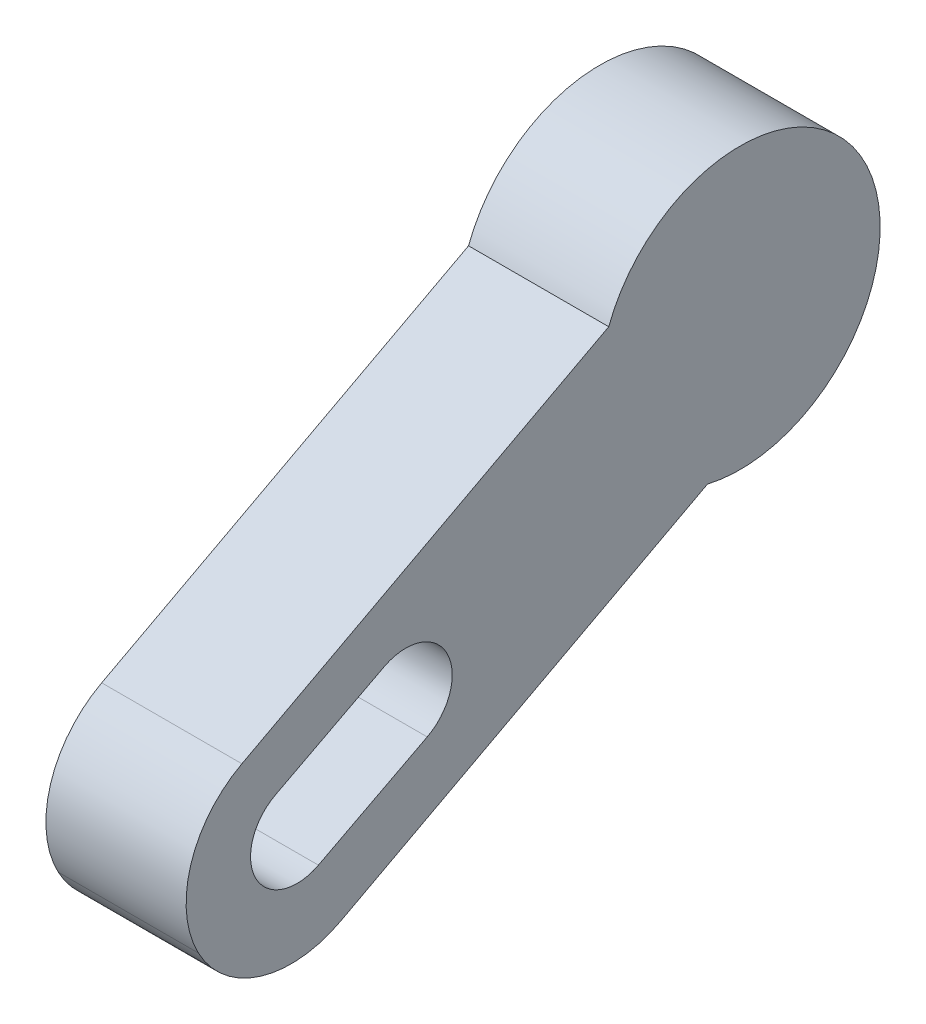
ISO-10303-21;
HEADER;
FILE_DESCRIPTION(('STEP AP214'),'2;1');
FILE_NAME('part.step','',(''),(''),'','','');
FILE_SCHEMA(('AUTOMOTIVE_DESIGN { 1 0 10303 214 1 1 1 1 }'));
ENDSEC;
DATA;
#1=APPLICATION_CONTEXT('core data for automotive mechanical design processes');
#2=APPLICATION_PROTOCOL_DEFINITION('international standard','automotive_design',2000,#1);
#3=PRODUCT_CONTEXT('',#1,'mechanical');
#4=PRODUCT('Part','Part','',(#3));
#5=PRODUCT_RELATED_PRODUCT_CATEGORY('part','',(#4));
#6=PRODUCT_DEFINITION_FORMATION('','',#4);
#7=PRODUCT_DEFINITION_CONTEXT('part definition',#1,'design');
#8=PRODUCT_DEFINITION('design','',#6,#7);
#9=PRODUCT_DEFINITION_SHAPE('','',#8);
#10=(LENGTH_UNIT() NAMED_UNIT(*) SI_UNIT(.MILLI.,.METRE.));
#11=(NAMED_UNIT(*) PLANE_ANGLE_UNIT() SI_UNIT($,.RADIAN.));
#12=(NAMED_UNIT(*) SI_UNIT($,.STERADIAN.) SOLID_ANGLE_UNIT());
#13=UNCERTAINTY_MEASURE_WITH_UNIT(LENGTH_MEASURE(1.E-05),#10,'distance_accuracy_value','');
#14=(GEOMETRIC_REPRESENTATION_CONTEXT(3) GLOBAL_UNCERTAINTY_ASSIGNED_CONTEXT((#13)) GLOBAL_UNIT_ASSIGNED_CONTEXT((#10,
#11,#12)) REPRESENTATION_CONTEXT('',''));
#15=CARTESIAN_POINT('',(0.,0.,0.));
#16=DIRECTION('',(0.,0.,1.));
#17=DIRECTION('',(1.,0.,0.));
#18=AXIS2_PLACEMENT_3D('',#15,#16,#17);
#19=CARTESIAN_POINT('',(2.5,0.,0.));
#20=DIRECTION('',(-1.,0.,0.));
#21=DIRECTION('',(0.,0.,1.));
#22=AXIS2_PLACEMENT_3D('',#19,#20,#21);
#23=PLANE('',#22);
#24=CARTESIAN_POINT('',(2.5,0.,0.));
#25=DIRECTION('',(-1.,0.,0.));
#26=DIRECTION('',(0.,0.,1.));
#27=AXIS2_PLACEMENT_3D('',#24,#25,#26);
#28=CIRCLE('',#27,2.6);
#29=CARTESIAN_POINT('',(2.5,0.,2.6));
#30=VERTEX_POINT('',#29);
#31=EDGE_CURVE('E272',#30,#30,#28,.T.);
#32=ORIENTED_EDGE('',*,*,#31,.T.);
#33=EDGE_LOOP('',(#32));
#34=FACE_BOUND('',#33,.T.);
#35=DIRECTION('',(0.,0.,-1.));
#36=VECTOR('',#35,1.);
#37=CARTESIAN_POINT('',(2.5,0.750000000000012,1.6));
#38=LINE('',#37,#36);
#39=CARTESIAN_POINT('',(2.5,0.75000000000001,1.3));
#40=VERTEX_POINT('',#39);
#41=CARTESIAN_POINT('',(2.5,0.750000000000006,0.649999999999994));
#42=VERTEX_POINT('',#41);
#43=EDGE_CURVE('E244',#40,#42,#38,.T.);
#44=ORIENTED_EDGE('',*,*,#43,.F.);
#45=CARTESIAN_POINT('',(2.5,0.45000000000001,1.3));
#46=DIRECTION('',(-1.,0.,0.));
#47=DIRECTION('',(0.,0.,1.));
#48=AXIS2_PLACEMENT_3D('',#45,#46,#47);
#49=CIRCLE('',#48,0.3);
#50=CARTESIAN_POINT('',(2.5,0.450000000000012,1.6));
#51=VERTEX_POINT('',#50);
#52=EDGE_CURVE('E326',#40,#51,#49,.F.);
#53=ORIENTED_EDGE('',*,*,#52,.T.);
#54=DIRECTION('',(0.,1.,0.));
#55=VECTOR('',#54,1.);
#56=CARTESIAN_POINT('',(2.5,-0.749999999999988,1.60000000000001));
#57=LINE('',#56,#55);
#58=CARTESIAN_POINT('',(2.5,-0.449999999999989,1.6));
#59=VERTEX_POINT('',#58);
#60=EDGE_CURVE('E196',#59,#51,#57,.T.);
#61=ORIENTED_EDGE('',*,*,#60,.F.);
#62=CARTESIAN_POINT('',(2.5,-0.449999999999991,1.3));
#63=DIRECTION('',(-1.,0.,0.));
#64=DIRECTION('',(0.,0.,1.));
#65=AXIS2_PLACEMENT_3D('',#62,#63,#64);
#66=CIRCLE('',#65,0.3);
#67=CARTESIAN_POINT('',(2.5,-0.749999999999991,1.30000000000001));
#68=VERTEX_POINT('',#67);
#69=EDGE_CURVE('E324',#59,#68,#66,.F.);
#70=ORIENTED_EDGE('',*,*,#69,.T.);
#71=DIRECTION('',(0.,0.,1.));
#72=VECTOR('',#71,1.);
#73=CARTESIAN_POINT('',(2.5,-0.749999999999988,1.60000000000001));
#74=LINE('',#73,#72);
#75=CARTESIAN_POINT('',(2.5,-0.750000000000009,-1.3));
#76=VERTEX_POINT('',#75);
#77=EDGE_CURVE('E224',#76,#68,#74,.T.);
#78=ORIENTED_EDGE('',*,*,#77,.F.);
#79=CARTESIAN_POINT('',(2.5,-0.450000000000009,-1.3));
#80=DIRECTION('',(-1.,0.,0.));
#81=DIRECTION('',(0.,0.,1.));
#82=AXIS2_PLACEMENT_3D('',#79,#80,#81);
#83=CIRCLE('',#82,0.3);
#84=CARTESIAN_POINT('',(2.5,-0.450000000000012,-1.6));
#85=VERTEX_POINT('',#84);
#86=EDGE_CURVE('E328',#76,#85,#83,.F.);
#87=ORIENTED_EDGE('',*,*,#86,.T.);
#88=DIRECTION('',(0.,-1.,0.));
#89=VECTOR('',#88,1.);
#90=CARTESIAN_POINT('',(2.5,-0.750000000000012,-1.6));
#91=LINE('',#90,#89);
#92=CARTESIAN_POINT('',(2.5,0.449999999999974,-1.6));
#93=VERTEX_POINT('',#92);
#94=EDGE_CURVE('E255',#93,#85,#91,.T.);
#95=ORIENTED_EDGE('',*,*,#94,.F.);
#96=CARTESIAN_POINT('',(2.5,0.449999999999976,-1.3));
#97=DIRECTION('',(-1.,0.,0.));
#98=DIRECTION('',(0.,0.,1.));
#99=AXIS2_PLACEMENT_3D('',#96,#97,#98);
#100=CIRCLE('',#99,0.3);
#101=CARTESIAN_POINT('',(2.5,0.749999999999976,-1.29999999999999));
#102=VERTEX_POINT('',#101);
#103=EDGE_CURVE('E330',#93,#102,#100,.F.);
#104=ORIENTED_EDGE('',*,*,#103,.T.);
#105=DIRECTION('',(0.,0.,-1.));
#106=VECTOR('',#105,1.);
#107=CARTESIAN_POINT('',(2.5,0.74999999999995,-0.650000000000005));
#108=LINE('',#107,#106);
#109=CARTESIAN_POINT('',(2.5,0.74999999999995,-0.650000000000005));
#110=VERTEX_POINT('',#109);
#111=EDGE_CURVE('E252',#110,#102,#108,.T.);
#112=ORIENTED_EDGE('',*,*,#111,.F.);
#113=DIRECTION('',(0.,-1.,0.));
#114=VECTOR('',#113,1.);
#115=CARTESIAN_POINT('',(2.5,0.74999999999995,-0.650000000000005));
#116=LINE('',#115,#114);
#117=CARTESIAN_POINT('',(2.5,1.24999999999995,-0.650000000000009));
#118=VERTEX_POINT('',#117);
#119=EDGE_CURVE('E250',#118,#110,#116,.T.);
#120=ORIENTED_EDGE('',*,*,#119,.F.);
#121=DIRECTION('',(0.,0.,-1.));
#122=VECTOR('',#121,1.);
#123=CARTESIAN_POINT('',(2.5,1.24999999999996,0.649999999999991));
#124=LINE('',#123,#122);
#125=CARTESIAN_POINT('',(2.5,1.24999999999996,0.649999999999991));
#126=VERTEX_POINT('',#125);
#127=EDGE_CURVE('E248',#126,#118,#124,.T.);
#128=ORIENTED_EDGE('',*,*,#127,.F.);
#129=DIRECTION('',(0.,1.,0.));
#130=VECTOR('',#129,1.);
#131=CARTESIAN_POINT('',(2.5,0.750000000000006,0.649999999999994));
#132=LINE('',#131,#130);
#133=EDGE_CURVE('E246',#42,#126,#132,.T.);
#134=ORIENTED_EDGE('',*,*,#133,.F.);
#135=EDGE_LOOP('',(#44,#53,#61,#70,#78,#87,#95,#104,#112,#120,#128,#134));
#136=FACE_BOUND('',#135,.T.);
#137=ADVANCED_FACE('F32',(#34,#136),#23,.T.);
#138=CARTESIAN_POINT('',(4.,0.,0.));
#139=DIRECTION('',(-1.,0.,0.));
#140=DIRECTION('',(0.,0.,1.));
#141=AXIS2_PLACEMENT_3D('',#138,#139,#140);
#142=CYLINDRICAL_SURFACE('',#141,4.);
#143=DIRECTION('',(-1.,0.,0.));
#144=VECTOR('',#143,1.);
#145=CARTESIAN_POINT('',(4.,1.40673777582846,3.7444744397655));
#146=LINE('',#145,#144);
#147=CARTESIAN_POINT('',(4.,1.40673777582846,3.7444744397655));
#148=VERTEX_POINT('',#147);
#149=CARTESIAN_POINT('',(0.,1.40673777582846,3.7444744397655));
#150=VERTEX_POINT('',#149);
#151=EDGE_CURVE('E288',#148,#150,#146,.T.);
#152=ORIENTED_EDGE('',*,*,#151,.F.);
#153=CARTESIAN_POINT('',(4.,0.,0.));
#154=DIRECTION('',(1.,0.,0.));
#155=DIRECTION('',(0.,0.,-1.));
#156=AXIS2_PLACEMENT_3D('',#153,#154,#155);
#157=CIRCLE('',#156,4.);
#158=CARTESIAN_POINT('',(4.,-3.8909477813251,0.927645063050152));
#159=VERTEX_POINT('',#158);
#160=EDGE_CURVE('E292',#159,#148,#157,.T.);
#161=ORIENTED_EDGE('',*,*,#160,.F.);
#162=DIRECTION('',(-1.,0.,0.));
#163=VECTOR('',#162,1.);
#164=CARTESIAN_POINT('',(4.,-3.8909477813251,0.927645063050152));
#165=LINE('',#164,#163);
#166=CARTESIAN_POINT('',(0.,-3.89094778132509,0.927645063050152));
#167=VERTEX_POINT('',#166);
#168=EDGE_CURVE('E283',#167,#159,#165,.F.);
#169=ORIENTED_EDGE('',*,*,#168,.F.);
#170=CARTESIAN_POINT('',(0.,0.,0.));
#171=DIRECTION('',(1.,0.,0.));
#172=DIRECTION('',(0.,0.,-1.));
#173=AXIS2_PLACEMENT_3D('',#170,#171,#172);
#174=CIRCLE('',#173,4.);
#175=EDGE_CURVE('E291',#167,#150,#174,.T.);
#176=ORIENTED_EDGE('',*,*,#175,.T.);
#177=EDGE_LOOP('',(#152,#161,#169,#176));
#178=FACE_BOUND('',#177,.T.);
#179=ADVANCED_FACE('F365',(#178),#142,.T.);
#180=CARTESIAN_POINT('',(4.,0.,0.));
#181=DIRECTION('',(1.,0.,0.));
#182=DIRECTION('',(0.,0.,-1.));
#183=AXIS2_PLACEMENT_3D('',#180,#181,#182);
#184=PLANE('',#183);
#185=CARTESIAN_POINT('',(4.,-4.96379759227663,9.53536645666587));
#186=DIRECTION('',(1.,0.,0.));
#187=DIRECTION('',(0.,0.,-1.));
#188=AXIS2_PLACEMENT_3D('',#185,#186,#187);
#189=CIRCLE('',#188,1.325);
#190=CARTESIAN_POINT('',(4.,-6.13908694623777,8.92354954412945));
#191=VERTEX_POINT('',#190);
#192=CARTESIAN_POINT('',(4.,-3.78850823831549,10.1471833692023));
#193=VERTEX_POINT('',#192);
#194=EDGE_CURVE('E183',#191,#193,#189,.T.);
#195=ORIENTED_EDGE('',*,*,#194,.F.);
#196=DIRECTION('',(0.,0.461748613235035,-0.887010833178221));
#197=VECTOR('',#196,1.);
#198=CARTESIAN_POINT('',(4.,-6.13908694623777,8.92354954412945));
#199=LINE('',#198,#197);
#200=CARTESIAN_POINT('',(4.,-7.7552070925604,12.0280874602532));
#201=VERTEX_POINT('',#200);
#202=EDGE_CURVE('E188',#201,#191,#199,.T.);
#203=ORIENTED_EDGE('',*,*,#202,.F.);
#204=CARTESIAN_POINT('',(4.,-6.57991773859925,12.6399043727896));
#205=DIRECTION('',(1.,0.,0.));
#206=DIRECTION('',(0.,0.,-1.));
#207=AXIS2_PLACEMENT_3D('',#204,#205,#206);
#208=CIRCLE('',#207,1.325);
#209=CARTESIAN_POINT('',(4.,-5.40462838463811,13.2517212853261));
#210=VERTEX_POINT('',#209);
#211=EDGE_CURVE('E211',#210,#201,#208,.T.);
#212=ORIENTED_EDGE('',*,*,#211,.F.);
#213=DIRECTION('',(0.,-0.461748613235035,0.887010833178221));
#214=VECTOR('',#213,1.);
#215=CARTESIAN_POINT('',(4.,-3.78850823831549,10.1471833692023));
#216=LINE('',#215,#214);
#217=EDGE_CURVE('E204',#193,#210,#216,.T.);
#218=ORIENTED_EDGE('',*,*,#217,.F.);
#219=EDGE_LOOP('',(#195,#203,#212,#218));
#220=FACE_BOUND('',#219,.T.);
#221=CARTESIAN_POINT('',(4.,-6.80733766039543,12.8027400964544));
#222=DIRECTION('',(1.,0.,0.));
#223=DIRECTION('',(0.,0.,-1.));
#224=AXIS2_PLACEMENT_3D('',#221,#222,#223);
#225=CIRCLE('',#224,3.);
#226=CARTESIAN_POINT('',(4.,-4.15849488181865,14.2111547848121));
#227=VERTEX_POINT('',#226);
#228=CARTESIAN_POINT('',(4.,-8.21575234875311,15.4515828750312));
#229=VERTEX_POINT('',#228);
#230=EDGE_CURVE('E48',#227,#229,#225,.T.);
#231=ORIENTED_EDGE('',*,*,#230,.T.);
#232=CARTESIAN_POINT('',(4.,-6.80733766039544,12.8027400964544));
#233=DIRECTION('',(1.,0.,0.));
#234=DIRECTION('',(0.,0.,-1.));
#235=AXIS2_PLACEMENT_3D('',#232,#233,#234);
#236=CIRCLE('',#235,3.);
#237=CARTESIAN_POINT('',(4.,-9.45618043897222,11.3943254080968));
#238=VERTEX_POINT('',#237);
#239=EDGE_CURVE('E41',#229,#238,#236,.T.);
#240=ORIENTED_EDGE('',*,*,#239,.T.);
#241=DIRECTION('',(0.,0.469471562785892,-0.882947592858926));
#242=VECTOR('',#241,1.);
#243=CARTESIAN_POINT('',(4.,-2.64884277857678,-1.40841468835768));
#244=LINE('',#243,#242);
#245=EDGE_CURVE('E280',#238,#159,#244,.T.);
#246=ORIENTED_EDGE('',*,*,#245,.T.);
#247=ORIENTED_EDGE('',*,*,#160,.T.);
#248=DIRECTION('',(0.,-0.469471562785892,0.882947592858926));
#249=VECTOR('',#248,1.);
#250=CARTESIAN_POINT('',(4.,2.64884277857678,1.40841468835768));
#251=LINE('',#250,#249);
#252=EDGE_CURVE('E278',#148,#227,#251,.T.);
#253=ORIENTED_EDGE('',*,*,#252,.T.);
#254=EDGE_LOOP('',(#231,#240,#246,#247,#253));
#255=FACE_BOUND('',#254,.T.);
#256=ADVANCED_FACE('F342',(#220,#255),#184,.T.);
#257=CARTESIAN_POINT('',(0.,0.,0.));
#258=DIRECTION('',(1.,0.,0.));
#259=DIRECTION('',(0.,0.,-1.));
#260=AXIS2_PLACEMENT_3D('',#257,#258,#259);
#261=PLANE('',#260);
#262=DIRECTION('',(0.,-0.461748613235035,0.887010833178221));
#263=VECTOR('',#262,1.);
#264=CARTESIAN_POINT('',(0.,-6.13908694623777,8.92354954412945));
#265=LINE('',#264,#263);
#266=CARTESIAN_POINT('',(0.,-6.13908694623777,8.92354954412945));
#267=VERTEX_POINT('',#266);
#268=CARTESIAN_POINT('',(0.,-7.7552070925604,12.0280874602532));
#269=VERTEX_POINT('',#268);
#270=EDGE_CURVE('E202',#267,#269,#265,.T.);
#271=ORIENTED_EDGE('',*,*,#270,.F.);
#272=CARTESIAN_POINT('',(0.,-4.96379759227663,9.53536645666587));
#273=DIRECTION('',(1.,0.,0.));
#274=DIRECTION('',(0.,0.,-1.));
#275=AXIS2_PLACEMENT_3D('',#272,#273,#274);
#276=CIRCLE('',#275,1.325);
#277=CARTESIAN_POINT('',(0.,-3.78850823831549,10.1471833692023));
#278=VERTEX_POINT('',#277);
#279=EDGE_CURVE('E180',#278,#267,#276,.F.);
#280=ORIENTED_EDGE('',*,*,#279,.F.);
#281=DIRECTION('',(0.,0.461748613235035,-0.887010833178221));
#282=VECTOR('',#281,1.);
#283=CARTESIAN_POINT('',(0.,-3.78850823831549,10.1471833692023));
#284=LINE('',#283,#282);
#285=CARTESIAN_POINT('',(0.,-5.40462838463811,13.2517212853261));
#286=VERTEX_POINT('',#285);
#287=EDGE_CURVE('E192',#286,#278,#284,.T.);
#288=ORIENTED_EDGE('',*,*,#287,.F.);
#289=CARTESIAN_POINT('',(0.,-6.57991773859925,12.6399043727896));
#290=DIRECTION('',(1.,0.,0.));
#291=DIRECTION('',(0.,0.,-1.));
#292=AXIS2_PLACEMENT_3D('',#289,#290,#291);
#293=CIRCLE('',#292,1.325);
#294=EDGE_CURVE('E206',#269,#286,#293,.F.);
#295=ORIENTED_EDGE('',*,*,#294,.F.);
#296=EDGE_LOOP('',(#271,#280,#288,#295));
#297=FACE_BOUND('',#296,.T.);
#298=CARTESIAN_POINT('',(0.,0.,0.));
#299=DIRECTION('',(-1.,0.,0.));
#300=DIRECTION('',(0.,0.,1.));
#301=AXIS2_PLACEMENT_3D('',#298,#299,#300);
#302=CIRCLE('',#301,2.6);
#303=CARTESIAN_POINT('',(0.,0.,2.6));
#304=VERTEX_POINT('',#303);
#305=EDGE_CURVE('E271',#304,#304,#302,.T.);
#306=ORIENTED_EDGE('',*,*,#305,.F.);
#307=EDGE_LOOP('',(#306));
#308=FACE_BOUND('',#307,.T.);
#309=DIRECTION('',(0.,0.469471562785892,-0.882947592858926));
#310=VECTOR('',#309,1.);
#311=CARTESIAN_POINT('',(0.,-2.64884277857678,-1.40841468835768));
#312=LINE('',#311,#310);
#313=CARTESIAN_POINT('',(0.,-9.45618043897222,11.3943254080968));
#314=VERTEX_POINT('',#313);
#315=EDGE_CURVE('E281',#314,#167,#312,.T.);
#316=ORIENTED_EDGE('',*,*,#315,.F.);
#317=CARTESIAN_POINT('',(0.,-6.80733766039544,12.8027400964544));
#318=DIRECTION('',(1.,0.,0.));
#319=DIRECTION('',(0.,0.,-1.));
#320=AXIS2_PLACEMENT_3D('',#317,#318,#319);
#321=CIRCLE('',#320,3.);
#322=CARTESIAN_POINT('',(0.,-8.21575234875311,15.4515828750312));
#323=VERTEX_POINT('',#322);
#324=EDGE_CURVE('E337',#314,#323,#321,.F.);
#325=ORIENTED_EDGE('',*,*,#324,.T.);
#326=CARTESIAN_POINT('',(0.,-6.80733766039543,12.8027400964544));
#327=DIRECTION('',(1.,0.,0.));
#328=DIRECTION('',(0.,0.,-1.));
#329=AXIS2_PLACEMENT_3D('',#326,#327,#328);
#330=CIRCLE('',#329,3.);
#331=CARTESIAN_POINT('',(0.,-4.15849488181865,14.2111547848121));
#332=VERTEX_POINT('',#331);
#333=EDGE_CURVE('E335',#323,#332,#330,.F.);
#334=ORIENTED_EDGE('',*,*,#333,.T.);
#335=DIRECTION('',(0.,-0.469471562785892,0.882947592858926));
#336=VECTOR('',#335,1.);
#337=CARTESIAN_POINT('',(0.,2.64884277857678,1.40841468835768));
#338=LINE('',#337,#336);
#339=EDGE_CURVE('E275',#150,#332,#338,.T.);
#340=ORIENTED_EDGE('',*,*,#339,.F.);
#341=ORIENTED_EDGE('',*,*,#175,.F.);
#342=EDGE_LOOP('',(#316,#325,#334,#340,#341));
#343=FACE_BOUND('',#342,.T.);
#344=ADVANCED_FACE('F199',(#297,#308,#343),#261,.F.);
#345=CARTESIAN_POINT('',(4.,2.64884277857678,1.40841468835768));
#346=DIRECTION('',(0.,-0.882947592858926,-0.469471562785892));
#347=DIRECTION('',(0.,0.469471562785892,-0.882947592858926));
#348=AXIS2_PLACEMENT_3D('',#345,#346,#347);
#349=PLANE('',#348);
#350=ORIENTED_EDGE('',*,*,#339,.T.);
#351=DIRECTION('',(-1.,0.,0.));
#352=VECTOR('',#351,1.);
#353=CARTESIAN_POINT('',(4.,-4.15849488181865,14.2111547848121));
#354=LINE('',#353,#352);
#355=EDGE_CURVE('E11',#332,#227,#354,.F.);
#356=ORIENTED_EDGE('',*,*,#355,.T.);
#357=ORIENTED_EDGE('',*,*,#252,.F.);
#358=ORIENTED_EDGE('',*,*,#151,.T.);
#359=EDGE_LOOP('',(#350,#356,#357,#358));
#360=FACE_BOUND('',#359,.T.);
#361=ADVANCED_FACE('F371',(#360),#349,.F.);
#362=CARTESIAN_POINT('',(4.,-2.64884277857678,-1.40841468835768));
#363=DIRECTION('',(0.,0.882947592858926,0.469471562785892));
#364=DIRECTION('',(0.,-0.469471562785892,0.882947592858926));
#365=AXIS2_PLACEMENT_3D('',#362,#363,#364);
#366=PLANE('',#365);
#367=ORIENTED_EDGE('',*,*,#245,.F.);
#368=DIRECTION('',(-1.,0.,0.));
#369=VECTOR('',#368,1.);
#370=CARTESIAN_POINT('',(4.,-9.45618043897222,11.3943254080968));
#371=LINE('',#370,#369);
#372=EDGE_CURVE('E332',#238,#314,#371,.T.);
#373=ORIENTED_EDGE('',*,*,#372,.T.);
#374=ORIENTED_EDGE('',*,*,#315,.T.);
#375=ORIENTED_EDGE('',*,*,#168,.T.);
#376=EDGE_LOOP('',(#367,#373,#374,#375));
#377=FACE_BOUND('',#376,.T.);
#378=ADVANCED_FACE('F348',(#377),#366,.F.);
#379=CARTESIAN_POINT('',(2.5,0.,0.));
#380=DIRECTION('',(-1.,0.,0.));
#381=DIRECTION('',(0.,0.,1.));
#382=AXIS2_PLACEMENT_3D('',#379,#380,#381);
#383=CYLINDRICAL_SURFACE('',#382,2.6);
#384=ORIENTED_EDGE('',*,*,#31,.F.);
#385=EDGE_LOOP('',(#384));
#386=FACE_BOUND('',#385,.T.);
#387=ORIENTED_EDGE('',*,*,#305,.T.);
#388=EDGE_LOOP('',(#387));
#389=FACE_BOUND('',#388,.T.);
#390=ADVANCED_FACE('F386',(#386,#389),#383,.F.);
#391=CARTESIAN_POINT('',(0.,-0.749999999999988,1.60000000000001));
#392=DIRECTION('',(0.,0.,-1.));
#393=DIRECTION('',(0.,1.,0.));
#394=AXIS2_PLACEMENT_3D('',#391,#392,#393);
#395=PLANE('',#394);
#396=DIRECTION('',(0.,1.,0.));
#397=VECTOR('',#396,1.);
#398=CARTESIAN_POINT('',(0.,-0.749999999999988,1.60000000000001));
#399=LINE('',#398,#397);
#400=CARTESIAN_POINT('',(0.,-0.449999999999989,1.6));
#401=VERTEX_POINT('',#400);
#402=CARTESIAN_POINT('',(0.,0.450000000000012,1.6));
#403=VERTEX_POINT('',#402);
#404=EDGE_CURVE('E220',#401,#403,#399,.T.);
#405=ORIENTED_EDGE('',*,*,#404,.F.);
#406=DIRECTION('',(1.,0.,0.));
#407=VECTOR('',#406,1.);
#408=CARTESIAN_POINT('',(0.,-0.449999999999989,1.6));
#409=LINE('',#408,#407);
#410=EDGE_CURVE('E298',#401,#59,#409,.T.);
#411=ORIENTED_EDGE('',*,*,#410,.T.);
#412=ORIENTED_EDGE('',*,*,#60,.T.);
#413=DIRECTION('',(1.,0.,0.));
#414=VECTOR('',#413,1.);
#415=CARTESIAN_POINT('',(0.,0.450000000000012,1.6));
#416=LINE('',#415,#414);
#417=EDGE_CURVE('E295',#51,#403,#416,.F.);
#418=ORIENTED_EDGE('',*,*,#417,.T.);
#419=EDGE_LOOP('',(#405,#411,#412,#418));
#420=FACE_BOUND('',#419,.T.);
#421=ADVANCED_FACE('F384',(#420),#395,.F.);
#422=CARTESIAN_POINT('',(0.,0.750000000000012,1.6));
#423=DIRECTION('',(0.,-1.,0.));
#424=DIRECTION('',(0.,0.,-1.));
#425=AXIS2_PLACEMENT_3D('',#422,#423,#424);
#426=PLANE('',#425);
#427=DIRECTION('',(0.,0.,-1.));
#428=VECTOR('',#427,1.);
#429=CARTESIAN_POINT('',(0.,0.750000000000012,1.6));
#430=LINE('',#429,#428);
#431=CARTESIAN_POINT('',(0.,0.75000000000001,1.3));
#432=VERTEX_POINT('',#431);
#433=CARTESIAN_POINT('',(0.,0.750000000000006,0.649999999999994));
#434=VERTEX_POINT('',#433);
#435=EDGE_CURVE('E223',#432,#434,#430,.T.);
#436=ORIENTED_EDGE('',*,*,#435,.F.);
#437=DIRECTION('',(1.,0.,0.));
#438=VECTOR('',#437,1.);
#439=CARTESIAN_POINT('',(0.,0.75000000000001,1.3));
#440=LINE('',#439,#438);
#441=EDGE_CURVE('E314',#432,#40,#440,.T.);
#442=ORIENTED_EDGE('',*,*,#441,.T.);
#443=ORIENTED_EDGE('',*,*,#43,.T.);
#444=DIRECTION('',(1.,0.,0.));
#445=VECTOR('',#444,1.);
#446=CARTESIAN_POINT('',(0.,0.750000000000006,0.649999999999994));
#447=LINE('',#446,#445);
#448=EDGE_CURVE('E268',#434,#42,#447,.T.);
#449=ORIENTED_EDGE('',*,*,#448,.F.);
#450=EDGE_LOOP('',(#436,#442,#443,#449));
#451=FACE_BOUND('',#450,.T.);
#452=ADVANCED_FACE('F413',(#451),#426,.F.);
#453=CARTESIAN_POINT('',(0.,0.750000000000006,0.649999999999994));
#454=DIRECTION('',(0.,0.,-1.));
#455=DIRECTION('',(0.,1.,0.));
#456=AXIS2_PLACEMENT_3D('',#453,#454,#455);
#457=PLANE('',#456);
#458=ORIENTED_EDGE('',*,*,#133,.T.);
#459=DIRECTION('',(1.,0.,0.));
#460=VECTOR('',#459,1.);
#461=CARTESIAN_POINT('',(0.,1.24999999999996,0.649999999999991));
#462=LINE('',#461,#460);
#463=CARTESIAN_POINT('',(0.,1.24999999999996,0.649999999999991));
#464=VERTEX_POINT('',#463);
#465=EDGE_CURVE('E265',#464,#126,#462,.T.);
#466=ORIENTED_EDGE('',*,*,#465,.F.);
#467=DIRECTION('',(0.,1.,0.));
#468=VECTOR('',#467,1.);
#469=CARTESIAN_POINT('',(0.,0.750000000000006,0.649999999999994));
#470=LINE('',#469,#468);
#471=EDGE_CURVE('E226',#434,#464,#470,.T.);
#472=ORIENTED_EDGE('',*,*,#471,.F.);
#473=ORIENTED_EDGE('',*,*,#448,.T.);
#474=EDGE_LOOP('',(#458,#466,#472,#473));
#475=FACE_BOUND('',#474,.T.);
#476=ADVANCED_FACE('F420',(#475),#457,.F.);
#477=CARTESIAN_POINT('',(0.,1.24999999999996,0.649999999999991));
#478=DIRECTION('',(0.,-1.,0.));
#479=DIRECTION('',(0.,0.,-1.));
#480=AXIS2_PLACEMENT_3D('',#477,#478,#479);
#481=PLANE('',#480);
#482=ORIENTED_EDGE('',*,*,#127,.T.);
#483=DIRECTION('',(1.,0.,0.));
#484=VECTOR('',#483,1.);
#485=CARTESIAN_POINT('',(0.,1.24999999999995,-0.650000000000009));
#486=LINE('',#485,#484);
#487=CARTESIAN_POINT('',(0.,1.24999999999995,-0.650000000000009));
#488=VERTEX_POINT('',#487);
#489=EDGE_CURVE('E262',#488,#118,#486,.T.);
#490=ORIENTED_EDGE('',*,*,#489,.F.);
#491=DIRECTION('',(0.,0.,-1.));
#492=VECTOR('',#491,1.);
#493=CARTESIAN_POINT('',(0.,1.24999999999996,0.649999999999991));
#494=LINE('',#493,#492);
#495=EDGE_CURVE('E228',#464,#488,#494,.T.);
#496=ORIENTED_EDGE('',*,*,#495,.F.);
#497=ORIENTED_EDGE('',*,*,#465,.T.);
#498=EDGE_LOOP('',(#482,#490,#496,#497));
#499=FACE_BOUND('',#498,.T.);
#500=ADVANCED_FACE('F427',(#499),#481,.F.);
#501=CARTESIAN_POINT('',(0.,0.74999999999995,-0.650000000000005));
#502=DIRECTION('',(0.,0.,1.));
#503=DIRECTION('',(0.,-1.,0.));
#504=AXIS2_PLACEMENT_3D('',#501,#502,#503);
#505=PLANE('',#504);
#506=ORIENTED_EDGE('',*,*,#119,.T.);
#507=DIRECTION('',(1.,0.,0.));
#508=VECTOR('',#507,1.);
#509=CARTESIAN_POINT('',(0.,0.74999999999995,-0.650000000000005));
#510=LINE('',#509,#508);
#511=CARTESIAN_POINT('',(0.,0.74999999999995,-0.650000000000005));
#512=VERTEX_POINT('',#511);
#513=EDGE_CURVE('E241',#512,#110,#510,.T.);
#514=ORIENTED_EDGE('',*,*,#513,.F.);
#515=DIRECTION('',(0.,-1.,0.));
#516=VECTOR('',#515,1.);
#517=CARTESIAN_POINT('',(0.,0.74999999999995,-0.650000000000005));
#518=LINE('',#517,#516);
#519=EDGE_CURVE('E230',#488,#512,#518,.T.);
#520=ORIENTED_EDGE('',*,*,#519,.F.);
#521=ORIENTED_EDGE('',*,*,#489,.T.);
#522=EDGE_LOOP('',(#506,#514,#520,#521));
#523=FACE_BOUND('',#522,.T.);
#524=ADVANCED_FACE('F435',(#523),#505,.F.);
#525=CARTESIAN_POINT('',(0.,0.74999999999995,-0.650000000000005));
#526=DIRECTION('',(0.,-1.,0.));
#527=DIRECTION('',(0.,0.,-1.));
#528=AXIS2_PLACEMENT_3D('',#525,#526,#527);
#529=PLANE('',#528);
#530=ORIENTED_EDGE('',*,*,#111,.T.);
#531=DIRECTION('',(1.,0.,0.));
#532=VECTOR('',#531,1.);
#533=CARTESIAN_POINT('',(0.,0.749999999999976,-1.29999999999999));
#534=LINE('',#533,#532);
#535=CARTESIAN_POINT('',(0.,0.749999999999976,-1.29999999999999));
#536=VERTEX_POINT('',#535);
#537=EDGE_CURVE('E322',#102,#536,#534,.F.);
#538=ORIENTED_EDGE('',*,*,#537,.T.);
#539=DIRECTION('',(0.,0.,-1.));
#540=VECTOR('',#539,1.);
#541=CARTESIAN_POINT('',(0.,0.74999999999995,-0.650000000000005));
#542=LINE('',#541,#540);
#543=EDGE_CURVE('E232',#512,#536,#542,.T.);
#544=ORIENTED_EDGE('',*,*,#543,.F.);
#545=ORIENTED_EDGE('',*,*,#513,.T.);
#546=EDGE_LOOP('',(#530,#538,#544,#545));
#547=FACE_BOUND('',#546,.T.);
#548=ADVANCED_FACE('F443',(#547),#529,.F.);
#549=CARTESIAN_POINT('',(0.,-0.750000000000012,-1.6));
#550=DIRECTION('',(0.,0.,1.));
#551=DIRECTION('',(0.,-1.,0.));
#552=AXIS2_PLACEMENT_3D('',#549,#550,#551);
#553=PLANE('',#552);
#554=ORIENTED_EDGE('',*,*,#94,.T.);
#555=DIRECTION('',(1.,0.,0.));
#556=VECTOR('',#555,1.);
#557=CARTESIAN_POINT('',(0.,-0.450000000000012,-1.6));
#558=LINE('',#557,#556);
#559=CARTESIAN_POINT('',(0.,-0.450000000000012,-1.6));
#560=VERTEX_POINT('',#559);
#561=EDGE_CURVE('E320',#85,#560,#558,.F.);
#562=ORIENTED_EDGE('',*,*,#561,.T.);
#563=DIRECTION('',(0.,-1.,0.));
#564=VECTOR('',#563,1.);
#565=CARTESIAN_POINT('',(0.,-0.750000000000012,-1.6));
#566=LINE('',#565,#564);
#567=CARTESIAN_POINT('',(0.,0.449999999999974,-1.6));
#568=VERTEX_POINT('',#567);
#569=EDGE_CURVE('E235',#568,#560,#566,.T.);
#570=ORIENTED_EDGE('',*,*,#569,.F.);
#571=DIRECTION('',(1.,0.,0.));
#572=VECTOR('',#571,1.);
#573=CARTESIAN_POINT('',(0.,0.449999999999974,-1.6));
#574=LINE('',#573,#572);
#575=EDGE_CURVE('E317',#568,#93,#574,.T.);
#576=ORIENTED_EDGE('',*,*,#575,.T.);
#577=EDGE_LOOP('',(#554,#562,#570,#576));
#578=FACE_BOUND('',#577,.T.);
#579=ADVANCED_FACE('F450',(#578),#553,.F.);
#580=CARTESIAN_POINT('',(0.,-0.749999999999988,1.60000000000001));
#581=DIRECTION('',(0.,1.,0.));
#582=DIRECTION('',(0.,0.,1.));
#583=AXIS2_PLACEMENT_3D('',#580,#581,#582);
#584=PLANE('',#583);
#585=ORIENTED_EDGE('',*,*,#77,.T.);
#586=DIRECTION('',(1.,0.,0.));
#587=VECTOR('',#586,1.);
#588=CARTESIAN_POINT('',(0.,-0.749999999999991,1.30000000000001));
#589=LINE('',#588,#587);
#590=CARTESIAN_POINT('',(0.,-0.749999999999991,1.30000000000001));
#591=VERTEX_POINT('',#590);
#592=EDGE_CURVE('E304',#68,#591,#589,.F.);
#593=ORIENTED_EDGE('',*,*,#592,.T.);
#594=DIRECTION('',(0.,0.,1.));
#595=VECTOR('',#594,1.);
#596=CARTESIAN_POINT('',(0.,-0.749999999999988,1.60000000000001));
#597=LINE('',#596,#595);
#598=CARTESIAN_POINT('',(0.,-0.750000000000009,-1.3));
#599=VERTEX_POINT('',#598);
#600=EDGE_CURVE('E238',#599,#591,#597,.T.);
#601=ORIENTED_EDGE('',*,*,#600,.F.);
#602=DIRECTION('',(1.,0.,0.));
#603=VECTOR('',#602,1.);
#604=CARTESIAN_POINT('',(0.,-0.750000000000009,-1.3));
#605=LINE('',#604,#603);
#606=EDGE_CURVE('E301',#599,#76,#605,.T.);
#607=ORIENTED_EDGE('',*,*,#606,.T.);
#608=EDGE_LOOP('',(#585,#593,#601,#607));
#609=FACE_BOUND('',#608,.T.);
#610=ADVANCED_FACE('F458',(#609),#584,.F.);
#611=CARTESIAN_POINT('',(0.,0.,0.));
#612=DIRECTION('',(-1.,0.,0.));
#613=DIRECTION('',(0.,0.,1.));
#614=AXIS2_PLACEMENT_3D('',#611,#612,#613);
#615=PLANE('',#614);
#616=ORIENTED_EDGE('',*,*,#600,.T.);
#617=CARTESIAN_POINT('',(0.,-0.449999999999991,1.3));
#618=DIRECTION('',(-1.,0.,0.));
#619=DIRECTION('',(0.,0.,1.));
#620=AXIS2_PLACEMENT_3D('',#617,#618,#619);
#621=CIRCLE('',#620,0.3);
#622=EDGE_CURVE('E312',#591,#401,#621,.T.);
#623=ORIENTED_EDGE('',*,*,#622,.T.);
#624=ORIENTED_EDGE('',*,*,#404,.T.);
#625=CARTESIAN_POINT('',(0.,0.45000000000001,1.3));
#626=DIRECTION('',(-1.,0.,0.));
#627=DIRECTION('',(0.,0.,1.));
#628=AXIS2_PLACEMENT_3D('',#625,#626,#627);
#629=CIRCLE('',#628,0.3);
#630=EDGE_CURVE('E310',#403,#432,#629,.T.);
#631=ORIENTED_EDGE('',*,*,#630,.T.);
#632=ORIENTED_EDGE('',*,*,#435,.T.);
#633=ORIENTED_EDGE('',*,*,#471,.T.);
#634=ORIENTED_EDGE('',*,*,#495,.T.);
#635=ORIENTED_EDGE('',*,*,#519,.T.);
#636=ORIENTED_EDGE('',*,*,#543,.T.);
#637=CARTESIAN_POINT('',(0.,0.449999999999976,-1.3));
#638=DIRECTION('',(-1.,0.,0.));
#639=DIRECTION('',(0.,0.,1.));
#640=AXIS2_PLACEMENT_3D('',#637,#638,#639);
#641=CIRCLE('',#640,0.3);
#642=EDGE_CURVE('E306',#536,#568,#641,.T.);
#643=ORIENTED_EDGE('',*,*,#642,.T.);
#644=ORIENTED_EDGE('',*,*,#569,.T.);
#645=CARTESIAN_POINT('',(0.,-0.450000000000009,-1.3));
#646=DIRECTION('',(-1.,0.,0.));
#647=DIRECTION('',(0.,0.,1.));
#648=AXIS2_PLACEMENT_3D('',#645,#646,#647);
#649=CIRCLE('',#648,0.3);
#650=EDGE_CURVE('E308',#560,#599,#649,.T.);
#651=ORIENTED_EDGE('',*,*,#650,.T.);
#652=EDGE_LOOP('',(#616,#623,#624,#631,#632,#633,#634,#635,#636,#643,#644,#651));
#653=FACE_BOUND('',#652,.T.);
#654=ADVANCED_FACE('F466',(#653),#615,.T.);
#655=CARTESIAN_POINT('',(0.,-0.449999999999991,1.3));
#656=DIRECTION('',(1.,0.,0.));
#657=DIRECTION('',(0.,0.,-1.));
#658=AXIS2_PLACEMENT_3D('',#655,#656,#657);
#659=CYLINDRICAL_SURFACE('',#658,0.3);
#660=ORIENTED_EDGE('',*,*,#622,.F.);
#661=ORIENTED_EDGE('',*,*,#592,.F.);
#662=ORIENTED_EDGE('',*,*,#69,.F.);
#663=ORIENTED_EDGE('',*,*,#410,.F.);
#664=EDGE_LOOP('',(#660,#661,#662,#663));
#665=FACE_BOUND('',#664,.T.);
#666=ADVANCED_FACE('F474',(#665),#659,.T.);
#667=CARTESIAN_POINT('',(0.,0.45000000000001,1.3));
#668=DIRECTION('',(1.,0.,0.));
#669=DIRECTION('',(0.,0.,-1.));
#670=AXIS2_PLACEMENT_3D('',#667,#668,#669);
#671=CYLINDRICAL_SURFACE('',#670,0.3);
#672=ORIENTED_EDGE('',*,*,#630,.F.);
#673=ORIENTED_EDGE('',*,*,#417,.F.);
#674=ORIENTED_EDGE('',*,*,#52,.F.);
#675=ORIENTED_EDGE('',*,*,#441,.F.);
#676=EDGE_LOOP('',(#672,#673,#674,#675));
#677=FACE_BOUND('',#676,.T.);
#678=ADVANCED_FACE('F482',(#677),#671,.T.);
#679=CARTESIAN_POINT('',(0.,-0.450000000000009,-1.3));
#680=DIRECTION('',(1.,0.,0.));
#681=DIRECTION('',(0.,0.,-1.));
#682=AXIS2_PLACEMENT_3D('',#679,#680,#681);
#683=CYLINDRICAL_SURFACE('',#682,0.3);
#684=ORIENTED_EDGE('',*,*,#650,.F.);
#685=ORIENTED_EDGE('',*,*,#561,.F.);
#686=ORIENTED_EDGE('',*,*,#86,.F.);
#687=ORIENTED_EDGE('',*,*,#606,.F.);
#688=EDGE_LOOP('',(#684,#685,#686,#687));
#689=FACE_BOUND('',#688,.T.);
#690=ADVANCED_FACE('F490',(#689),#683,.T.);
#691=CARTESIAN_POINT('',(0.,0.449999999999976,-1.3));
#692=DIRECTION('',(1.,0.,0.));
#693=DIRECTION('',(0.,0.,-1.));
#694=AXIS2_PLACEMENT_3D('',#691,#692,#693);
#695=CYLINDRICAL_SURFACE('',#694,0.3);
#696=ORIENTED_EDGE('',*,*,#642,.F.);
#697=ORIENTED_EDGE('',*,*,#537,.F.);
#698=ORIENTED_EDGE('',*,*,#103,.F.);
#699=ORIENTED_EDGE('',*,*,#575,.F.);
#700=EDGE_LOOP('',(#696,#697,#698,#699));
#701=FACE_BOUND('',#700,.T.);
#702=ADVANCED_FACE('F498',(#701),#695,.T.);
#703=CARTESIAN_POINT('',(-0.00100000000000013,-4.96379759227663,9.53536645666587));
#704=DIRECTION('',(1.,0.,0.));
#705=DIRECTION('',(0.,0.,-1.));
#706=AXIS2_PLACEMENT_3D('',#703,#704,#705);
#707=CYLINDRICAL_SURFACE('',#706,1.325);
#708=ORIENTED_EDGE('',*,*,#279,.T.);
#709=DIRECTION('',(1.,0.,0.));
#710=VECTOR('',#709,1.);
#711=CARTESIAN_POINT('',(-0.00100000000000013,-6.13908694623777,8.92354954412945));
#712=LINE('',#711,#710);
#713=EDGE_CURVE('E197',#267,#191,#712,.T.);
#714=ORIENTED_EDGE('',*,*,#713,.T.);
#715=ORIENTED_EDGE('',*,*,#194,.T.);
#716=DIRECTION('',(1.,0.,0.));
#717=VECTOR('',#716,1.);
#718=CARTESIAN_POINT('',(-0.00100000000000013,-3.78850823831549,10.1471833692023));
#719=LINE('',#718,#717);
#720=EDGE_CURVE('E176',#278,#193,#719,.T.);
#721=ORIENTED_EDGE('',*,*,#720,.F.);
#722=EDGE_LOOP('',(#708,#714,#715,#721));
#723=FACE_BOUND('',#722,.T.);
#724=ADVANCED_FACE('F178',(#723),#707,.F.);
#725=CARTESIAN_POINT('',(-0.00100000000000013,-6.13908694623777,8.92354954412945));
#726=DIRECTION('',(0.,-0.887010833178221,-0.461748613235035));
#727=DIRECTION('',(0.,0.461748613235035,-0.887010833178221));
#728=AXIS2_PLACEMENT_3D('',#725,#726,#727);
#729=PLANE('',#728);
#730=ORIENTED_EDGE('',*,*,#270,.T.);
#731=DIRECTION('',(1.,0.,0.));
#732=VECTOR('',#731,1.);
#733=CARTESIAN_POINT('',(-0.00100000000000013,-7.7552070925604,12.0280874602532));
#734=LINE('',#733,#732);
#735=EDGE_CURVE('E217',#269,#201,#734,.T.);
#736=ORIENTED_EDGE('',*,*,#735,.T.);
#737=ORIENTED_EDGE('',*,*,#202,.T.);
#738=ORIENTED_EDGE('',*,*,#713,.F.);
#739=EDGE_LOOP('',(#730,#736,#737,#738));
#740=FACE_BOUND('',#739,.T.);
#741=ADVANCED_FACE('F362',(#740),#729,.F.);
#742=CARTESIAN_POINT('',(-0.00100000000000013,-6.57991773859925,12.6399043727896));
#743=DIRECTION('',(1.,0.,0.));
#744=DIRECTION('',(0.,0.,-1.));
#745=AXIS2_PLACEMENT_3D('',#742,#743,#744);
#746=CYLINDRICAL_SURFACE('',#745,1.325);
#747=ORIENTED_EDGE('',*,*,#294,.T.);
#748=DIRECTION('',(1.,0.,0.));
#749=VECTOR('',#748,1.);
#750=CARTESIAN_POINT('',(-0.00100000000000013,-5.40462838463811,13.2517212853261));
#751=LINE('',#750,#749);
#752=EDGE_CURVE('E187',#286,#210,#751,.T.);
#753=ORIENTED_EDGE('',*,*,#752,.T.);
#754=ORIENTED_EDGE('',*,*,#211,.T.);
#755=ORIENTED_EDGE('',*,*,#735,.F.);
#756=EDGE_LOOP('',(#747,#753,#754,#755));
#757=FACE_BOUND('',#756,.T.);
#758=ADVANCED_FACE('F358',(#757),#746,.F.);
#759=CARTESIAN_POINT('',(-0.00100000000000013,-3.78850823831549,10.1471833692023));
#760=DIRECTION('',(0.,0.887010833178221,0.461748613235035));
#761=DIRECTION('',(0.,-0.461748613235035,0.887010833178221));
#762=AXIS2_PLACEMENT_3D('',#759,#760,#761);
#763=PLANE('',#762);
#764=ORIENTED_EDGE('',*,*,#287,.T.);
#765=ORIENTED_EDGE('',*,*,#720,.T.);
#766=ORIENTED_EDGE('',*,*,#217,.T.);
#767=ORIENTED_EDGE('',*,*,#752,.F.);
#768=EDGE_LOOP('',(#764,#765,#766,#767));
#769=FACE_BOUND('',#768,.T.);
#770=ADVANCED_FACE('F193',(#769),#763,.F.);
#771=CARTESIAN_POINT('',(4.,-6.80733766039543,12.8027400964544));
#772=DIRECTION('',(-1.,0.,0.));
#773=DIRECTION('',(0.,0.,1.));
#774=AXIS2_PLACEMENT_3D('',#771,#772,#773);
#775=CYLINDRICAL_SURFACE('',#774,3.);
#776=DIRECTION('',(-1.,0.,0.));
#777=VECTOR('',#776,1.);
#778=CARTESIAN_POINT('',(4.,-8.21575234875311,15.4515828750312));
#779=LINE('',#778,#777);
#780=EDGE_CURVE('E36',#229,#323,#779,.T.);
#781=ORIENTED_EDGE('',*,*,#780,.F.);
#782=ORIENTED_EDGE('',*,*,#230,.F.);
#783=ORIENTED_EDGE('',*,*,#355,.F.);
#784=ORIENTED_EDGE('',*,*,#333,.F.);
#785=EDGE_LOOP('',(#781,#782,#783,#784));
#786=FACE_BOUND('',#785,.T.);
#787=ADVANCED_FACE('F34',(#786),#775,.T.);
#788=CARTESIAN_POINT('',(4.,-6.80733766039544,12.8027400964544));
#789=DIRECTION('',(-1.,0.,0.));
#790=DIRECTION('',(0.,0.,1.));
#791=AXIS2_PLACEMENT_3D('',#788,#789,#790);
#792=CYLINDRICAL_SURFACE('',#791,3.);
#793=ORIENTED_EDGE('',*,*,#239,.F.);
#794=ORIENTED_EDGE('',*,*,#780,.T.);
#795=ORIENTED_EDGE('',*,*,#324,.F.);
#796=ORIENTED_EDGE('',*,*,#372,.F.);
#797=EDGE_LOOP('',(#793,#794,#795,#796));
#798=FACE_BOUND('',#797,.T.);
#799=ADVANCED_FACE('F351',(#798),#792,.T.);
#800=CLOSED_SHELL('',(#137,#179,#256,#344,#361,#378,#390,#421,#452,#476,#500,#524,#548,#579,
#610,#654,#666,#678,#690,#702,#724,#741,#758,#770,#787,#799));
#801=MANIFOLD_SOLID_BREP('B2',#800);
#802=ADVANCED_BREP_SHAPE_REPRESENTATION('',(#18,#801),#14);
#803=SHAPE_DEFINITION_REPRESENTATION(#9,#802);
ENDSEC;
END-ISO-10303-21;
